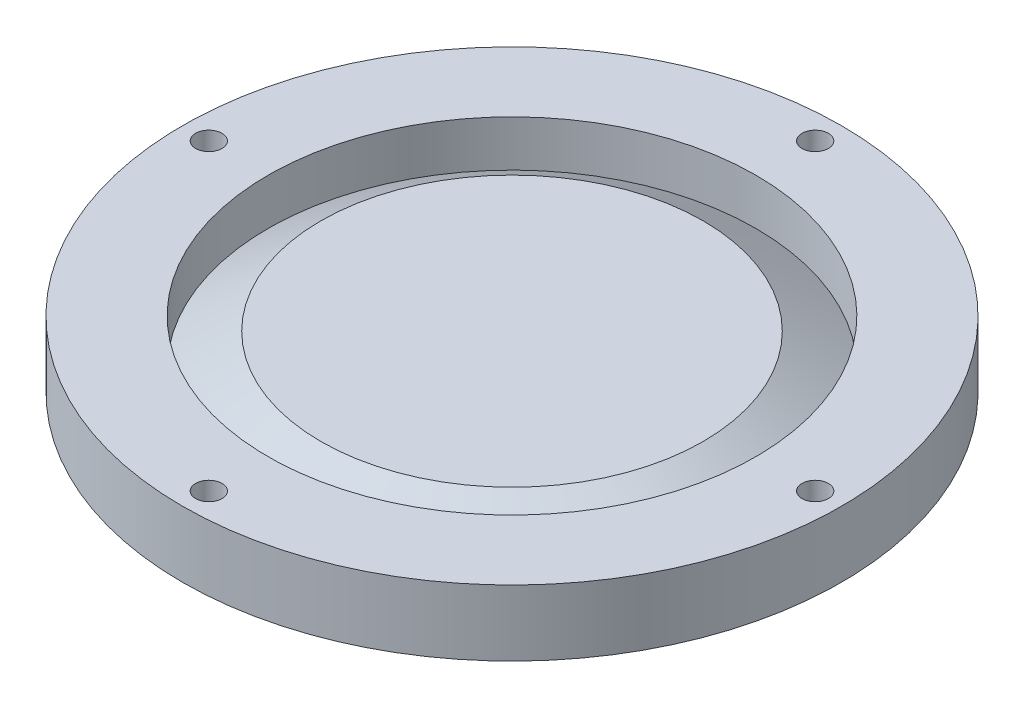
ISO-10303-21;
HEADER;
FILE_DESCRIPTION(('STEP AP214'),'2;1');
FILE_NAME('part.step','',(''),(''),'','','');
FILE_SCHEMA(('AUTOMOTIVE_DESIGN { 1 0 10303 214 1 1 1 1 }'));
ENDSEC;
DATA;
#1=APPLICATION_CONTEXT('core data for automotive mechanical design processes');
#2=APPLICATION_PROTOCOL_DEFINITION('international standard','automotive_design',2000,#1);
#3=PRODUCT_CONTEXT('',#1,'mechanical');
#4=PRODUCT('Part','Part','',(#3));
#5=PRODUCT_RELATED_PRODUCT_CATEGORY('part','',(#4));
#6=PRODUCT_DEFINITION_FORMATION('','',#4);
#7=PRODUCT_DEFINITION_CONTEXT('part definition',#1,'design');
#8=PRODUCT_DEFINITION('design','',#6,#7);
#9=PRODUCT_DEFINITION_SHAPE('','',#8);
#10=(LENGTH_UNIT() NAMED_UNIT(*) SI_UNIT(.MILLI.,.METRE.));
#11=(NAMED_UNIT(*) PLANE_ANGLE_UNIT() SI_UNIT($,.RADIAN.));
#12=(NAMED_UNIT(*) SI_UNIT($,.STERADIAN.) SOLID_ANGLE_UNIT());
#13=UNCERTAINTY_MEASURE_WITH_UNIT(LENGTH_MEASURE(1.E-05),#10,'distance_accuracy_value','');
#14=(GEOMETRIC_REPRESENTATION_CONTEXT(3) GLOBAL_UNCERTAINTY_ASSIGNED_CONTEXT((#13)) GLOBAL_UNIT_ASSIGNED_CONTEXT((#10,
#11,#12)) REPRESENTATION_CONTEXT('',''));
#15=CARTESIAN_POINT('',(0.,0.,0.));
#16=DIRECTION('',(0.,0.,1.));
#17=DIRECTION('',(1.,0.,0.));
#18=AXIS2_PLACEMENT_3D('',#15,#16,#17);
#19=CARTESIAN_POINT('',(0.,5.,0.));
#20=DIRECTION('',(0.,-1.,0.));
#21=DIRECTION('',(0.,0.,-1.));
#22=AXIS2_PLACEMENT_3D('',#19,#20,#21);
#23=CYLINDRICAL_SURFACE('',#22,25.);
#24=CARTESIAN_POINT('',(0.,5.,0.));
#25=DIRECTION('',(0.,1.,0.));
#26=DIRECTION('',(0.,0.,1.));
#27=AXIS2_PLACEMENT_3D('',#24,#25,#26);
#28=CIRCLE('',#27,25.);
#29=CARTESIAN_POINT('',(0.,5.,25.));
#30=VERTEX_POINT('',#29);
#31=EDGE_CURVE('E10',#30,#30,#28,.T.);
#32=ORIENTED_EDGE('',*,*,#31,.F.);
#33=EDGE_LOOP('',(#32));
#34=FACE_BOUND('',#33,.T.);
#35=CARTESIAN_POINT('',(0.,0.,0.));
#36=DIRECTION('',(0.,1.,0.));
#37=DIRECTION('',(0.,0.,1.));
#38=AXIS2_PLACEMENT_3D('',#35,#36,#37);
#39=CIRCLE('',#38,25.);
#40=CARTESIAN_POINT('',(0.,0.,25.));
#41=VERTEX_POINT('',#40);
#42=EDGE_CURVE('E35',#41,#41,#39,.T.);
#43=ORIENTED_EDGE('',*,*,#42,.T.);
#44=EDGE_LOOP('',(#43));
#45=FACE_BOUND('',#44,.T.);
#46=ADVANCED_FACE('F32',(#34,#45),#23,.T.);
#47=CARTESIAN_POINT('',(0.,5.,0.));
#48=DIRECTION('',(0.,1.,0.));
#49=DIRECTION('',(0.,0.,1.));
#50=AXIS2_PLACEMENT_3D('',#47,#48,#49);
#51=PLANE('',#50);
#52=CARTESIAN_POINT('',(0.,5.,-23.));
#53=DIRECTION('',(0.,1.,0.));
#54=DIRECTION('',(0.,0.,1.));
#55=AXIS2_PLACEMENT_3D('',#52,#53,#54);
#56=CIRCLE('',#55,1.);
#57=CARTESIAN_POINT('',(0.,5.,-22.));
#58=VERTEX_POINT('',#57);
#59=EDGE_CURVE('E71',#58,#58,#56,.T.);
#60=ORIENTED_EDGE('',*,*,#59,.F.);
#61=EDGE_LOOP('',(#60));
#62=FACE_BOUND('',#61,.T.);
#63=CARTESIAN_POINT('',(23.,5.,0.));
#64=DIRECTION('',(0.,1.,0.));
#65=DIRECTION('',(0.,0.,1.));
#66=AXIS2_PLACEMENT_3D('',#63,#64,#65);
#67=CIRCLE('',#66,1.);
#68=CARTESIAN_POINT('',(23.,5.,1.00000000000008));
#69=VERTEX_POINT('',#68);
#70=EDGE_CURVE('E65',#69,#69,#67,.T.);
#71=ORIENTED_EDGE('',*,*,#70,.F.);
#72=EDGE_LOOP('',(#71));
#73=FACE_BOUND('',#72,.T.);
#74=CARTESIAN_POINT('',(6.45249253985176E-13,5.,23.));
#75=DIRECTION('',(0.,1.,0.));
#76=DIRECTION('',(0.,0.,1.));
#77=AXIS2_PLACEMENT_3D('',#74,#75,#76);
#78=CIRCLE('',#77,1.00000000000077);
#79=CARTESIAN_POINT('',(6.45249253985176E-13,5.,24.0000000000008));
#80=VERTEX_POINT('',#79);
#81=EDGE_CURVE('E59',#80,#80,#78,.T.);
#82=ORIENTED_EDGE('',*,*,#81,.F.);
#83=EDGE_LOOP('',(#82));
#84=FACE_BOUND('',#83,.T.);
#85=CARTESIAN_POINT('',(-22.9999999999997,5.,3.25441314630627E-13));
#86=DIRECTION('',(0.,1.,0.));
#87=DIRECTION('',(0.,0.,1.));
#88=AXIS2_PLACEMENT_3D('',#85,#86,#87);
#89=CIRCLE('',#88,1.00000000000064);
#90=CARTESIAN_POINT('',(-22.9999999999997,5.,1.00000000000096));
#91=VERTEX_POINT('',#90);
#92=EDGE_CURVE('E53',#91,#91,#89,.T.);
#93=ORIENTED_EDGE('',*,*,#92,.F.);
#94=EDGE_LOOP('',(#93));
#95=FACE_BOUND('',#94,.T.);
#96=CARTESIAN_POINT('',(0.,5.00000000000001,0.));
#97=DIRECTION('',(0.,-1.,0.));
#98=DIRECTION('',(0.,0.,-1.));
#99=AXIS2_PLACEMENT_3D('',#96,#97,#98);
#100=CIRCLE('',#99,18.5);
#101=CARTESIAN_POINT('',(0.,5.00000000000001,-18.5));
#102=VERTEX_POINT('',#101);
#103=EDGE_CURVE('E49',#102,#102,#100,.T.);
#104=ORIENTED_EDGE('',*,*,#103,.T.);
#105=EDGE_LOOP('',(#104));
#106=FACE_BOUND('',#105,.T.);
#107=ORIENTED_EDGE('',*,*,#31,.T.);
#108=EDGE_LOOP('',(#107));
#109=FACE_BOUND('',#108,.T.);
#110=ADVANCED_FACE('F87',(#62,#73,#84,#95,#106,#109),#51,.T.);
#111=CARTESIAN_POINT('',(0.,0.,0.));
#112=DIRECTION('',(0.,1.,0.));
#113=DIRECTION('',(0.,0.,1.));
#114=AXIS2_PLACEMENT_3D('',#111,#112,#113);
#115=PLANE('',#114);
#116=CARTESIAN_POINT('',(0.,0.,-23.));
#117=DIRECTION('',(0.,1.,0.));
#118=DIRECTION('',(0.,0.,1.));
#119=AXIS2_PLACEMENT_3D('',#116,#117,#118);
#120=CIRCLE('',#119,1.);
#121=CARTESIAN_POINT('',(0.,0.,-22.));
#122=VERTEX_POINT('',#121);
#123=EDGE_CURVE('E52',#122,#122,#120,.T.);
#124=ORIENTED_EDGE('',*,*,#123,.T.);
#125=EDGE_LOOP('',(#124));
#126=FACE_BOUND('',#125,.T.);
#127=CARTESIAN_POINT('',(23.,0.,0.));
#128=DIRECTION('',(0.,1.,0.));
#129=DIRECTION('',(0.,0.,1.));
#130=AXIS2_PLACEMENT_3D('',#127,#128,#129);
#131=CIRCLE('',#130,1.);
#132=CARTESIAN_POINT('',(23.,0.,1.00000000000008));
#133=VERTEX_POINT('',#132);
#134=EDGE_CURVE('E68',#133,#133,#131,.T.);
#135=ORIENTED_EDGE('',*,*,#134,.T.);
#136=EDGE_LOOP('',(#135));
#137=FACE_BOUND('',#136,.T.);
#138=CARTESIAN_POINT('',(6.45249253985176E-13,0.,23.));
#139=DIRECTION('',(0.,1.,0.));
#140=DIRECTION('',(0.,0.,1.));
#141=AXIS2_PLACEMENT_3D('',#138,#139,#140);
#142=CIRCLE('',#141,1.00000000000077);
#143=CARTESIAN_POINT('',(6.45249253985176E-13,0.,24.0000000000008));
#144=VERTEX_POINT('',#143);
#145=EDGE_CURVE('E62',#144,#144,#142,.T.);
#146=ORIENTED_EDGE('',*,*,#145,.T.);
#147=EDGE_LOOP('',(#146));
#148=FACE_BOUND('',#147,.T.);
#149=CARTESIAN_POINT('',(-22.9999999999997,0.,3.25441314630627E-13));
#150=DIRECTION('',(0.,1.,0.));
#151=DIRECTION('',(0.,0.,1.));
#152=AXIS2_PLACEMENT_3D('',#149,#150,#151);
#153=CIRCLE('',#152,1.00000000000064);
#154=CARTESIAN_POINT('',(-22.9999999999997,0.,1.00000000000096));
#155=VERTEX_POINT('',#154);
#156=EDGE_CURVE('E56',#155,#155,#153,.T.);
#157=ORIENTED_EDGE('',*,*,#156,.T.);
#158=EDGE_LOOP('',(#157));
#159=FACE_BOUND('',#158,.T.);
#160=ORIENTED_EDGE('',*,*,#42,.F.);
#161=EDGE_LOOP('',(#160));
#162=FACE_BOUND('',#161,.T.);
#163=ADVANCED_FACE('F77',(#126,#137,#148,#159,#162),#115,.F.);
#164=CARTESIAN_POINT('',(0.,4.00000000000001,0.));
#165=DIRECTION('',(0.,1.,0.));
#166=DIRECTION('',(0.,0.,1.));
#167=AXIS2_PLACEMENT_3D('',#164,#165,#166);
#168=PLANE('',#167);
#169=CARTESIAN_POINT('',(0.,4.00000000000001,0.));
#170=DIRECTION('',(0.,-1.,0.));
#171=DIRECTION('',(0.,0.,-1.));
#172=AXIS2_PLACEMENT_3D('',#169,#170,#171);
#173=CIRCLE('',#172,14.5);
#174=CARTESIAN_POINT('',(0.,4.00000000000001,-14.5));
#175=VERTEX_POINT('',#174);
#176=EDGE_CURVE('E42',#175,#175,#173,.T.);
#177=ORIENTED_EDGE('',*,*,#176,.F.);
#178=EDGE_LOOP('',(#177));
#179=FACE_BOUND('',#178,.T.);
#180=ADVANCED_FACE('F109',(#179),#168,.T.);
#181=CARTESIAN_POINT('',(0.,4.00000000000001,0.));
#182=DIRECTION('',(0.,-1.,0.));
#183=DIRECTION('',(0.,0.,-1.));
#184=AXIS2_PLACEMENT_3D('',#181,#182,#183);
#185=CONICAL_SURFACE('',#184,14.5,1.01219701145133);
#186=CARTESIAN_POINT('',(0.,1.50000000000001,0.));
#187=DIRECTION('',(0.,-1.,0.));
#188=DIRECTION('',(0.,0.,-1.));
#189=AXIS2_PLACEMENT_3D('',#186,#187,#188);
#190=CIRCLE('',#189,18.5);
#191=CARTESIAN_POINT('',(0.,1.50000000000001,-18.5));
#192=VERTEX_POINT('',#191);
#193=EDGE_CURVE('E46',#192,#192,#190,.T.);
#194=ORIENTED_EDGE('',*,*,#193,.F.);
#195=EDGE_LOOP('',(#194));
#196=FACE_BOUND('',#195,.T.);
#197=ORIENTED_EDGE('',*,*,#176,.T.);
#198=EDGE_LOOP('',(#197));
#199=FACE_BOUND('',#198,.T.);
#200=ADVANCED_FACE('F103',(#196,#199),#185,.T.);
#201=CARTESIAN_POINT('',(0.,0.,0.));
#202=DIRECTION('',(0.,-1.,0.));
#203=DIRECTION('',(0.,0.,-1.));
#204=AXIS2_PLACEMENT_3D('',#201,#202,#203);
#205=CYLINDRICAL_SURFACE('',#204,18.5);
#206=ORIENTED_EDGE('',*,*,#103,.F.);
#207=EDGE_LOOP('',(#206));
#208=FACE_BOUND('',#207,.T.);
#209=ORIENTED_EDGE('',*,*,#193,.T.);
#210=EDGE_LOOP('',(#209));
#211=FACE_BOUND('',#210,.T.);
#212=ADVANCED_FACE('F99',(#208,#211),#205,.F.);
#213=CARTESIAN_POINT('',(-22.9999999999997,0.,3.25441314630627E-13));
#214=DIRECTION('',(0.,1.,0.));
#215=DIRECTION('',(0.,0.,1.));
#216=AXIS2_PLACEMENT_3D('',#213,#214,#215);
#217=CYLINDRICAL_SURFACE('',#216,1.00000000000064);
#218=ORIENTED_EDGE('',*,*,#156,.F.);
#219=EDGE_LOOP('',(#218));
#220=FACE_BOUND('',#219,.T.);
#221=ORIENTED_EDGE('',*,*,#92,.T.);
#222=EDGE_LOOP('',(#221));
#223=FACE_BOUND('',#222,.T.);
#224=ADVANCED_FACE('F102',(#220,#223),#217,.F.);
#225=CARTESIAN_POINT('',(6.45249253985176E-13,0.,23.));
#226=DIRECTION('',(0.,1.,0.));
#227=DIRECTION('',(0.,0.,1.));
#228=AXIS2_PLACEMENT_3D('',#225,#226,#227);
#229=CYLINDRICAL_SURFACE('',#228,1.00000000000077);
#230=ORIENTED_EDGE('',*,*,#145,.F.);
#231=EDGE_LOOP('',(#230));
#232=FACE_BOUND('',#231,.T.);
#233=ORIENTED_EDGE('',*,*,#81,.T.);
#234=EDGE_LOOP('',(#233));
#235=FACE_BOUND('',#234,.T.);
#236=ADVANCED_FACE('F144',(#232,#235),#229,.F.);
#237=CARTESIAN_POINT('',(23.,0.,0.));
#238=DIRECTION('',(0.,1.,0.));
#239=DIRECTION('',(0.,0.,1.));
#240=AXIS2_PLACEMENT_3D('',#237,#238,#239);
#241=CYLINDRICAL_SURFACE('',#240,1.);
#242=ORIENTED_EDGE('',*,*,#134,.F.);
#243=EDGE_LOOP('',(#242));
#244=FACE_BOUND('',#243,.T.);
#245=ORIENTED_EDGE('',*,*,#70,.T.);
#246=EDGE_LOOP('',(#245));
#247=FACE_BOUND('',#246,.T.);
#248=ADVANCED_FACE('F83',(#244,#247),#241,.F.);
#249=CARTESIAN_POINT('',(0.,0.,-23.));
#250=DIRECTION('',(0.,1.,0.));
#251=DIRECTION('',(0.,0.,1.));
#252=AXIS2_PLACEMENT_3D('',#249,#250,#251);
#253=CYLINDRICAL_SURFACE('',#252,1.);
#254=ORIENTED_EDGE('',*,*,#123,.F.);
#255=EDGE_LOOP('',(#254));
#256=FACE_BOUND('',#255,.T.);
#257=ORIENTED_EDGE('',*,*,#59,.T.);
#258=EDGE_LOOP('',(#257));
#259=FACE_BOUND('',#258,.T.);
#260=ADVANCED_FACE('F80',(#256,#259),#253,.F.);
#261=CLOSED_SHELL('',(#46,#110,#163,#180,#200,#212,#224,#236,#248,#260));
#262=MANIFOLD_SOLID_BREP('B2',#261);
#263=ADVANCED_BREP_SHAPE_REPRESENTATION('',(#18,#262),#14);
#264=SHAPE_DEFINITION_REPRESENTATION(#9,#263);
ENDSEC;
END-ISO-10303-21;
